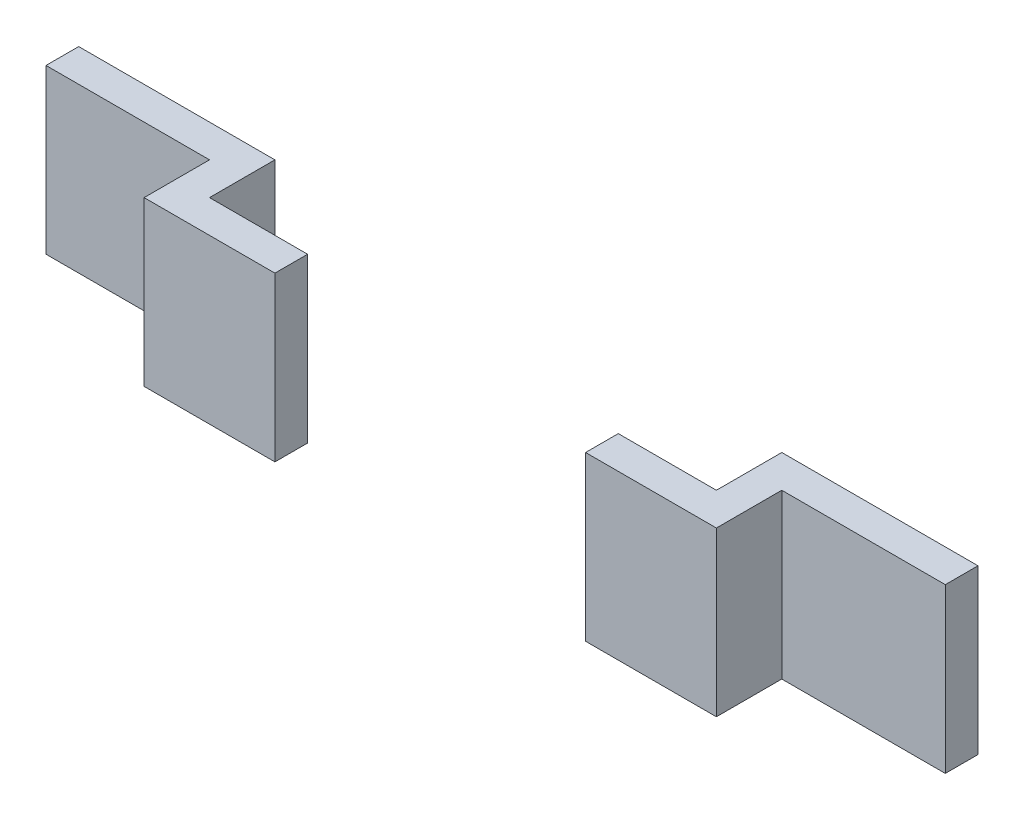
ISO-10303-21;
HEADER;
FILE_DESCRIPTION(('STEP AP214'),'2;1');
FILE_NAME('part.step','',(''),(''),'','','');
FILE_SCHEMA(('AUTOMOTIVE_DESIGN { 1 0 10303 214 1 1 1 1 }'));
ENDSEC;
DATA;
#1=APPLICATION_CONTEXT('core data for automotive mechanical design processes');
#2=APPLICATION_PROTOCOL_DEFINITION('international standard','automotive_design',2000,#1);
#3=PRODUCT_CONTEXT('',#1,'mechanical');
#4=PRODUCT('Part','Part','',(#3));
#5=PRODUCT_RELATED_PRODUCT_CATEGORY('part','',(#4));
#6=PRODUCT_DEFINITION_FORMATION('','',#4);
#7=PRODUCT_DEFINITION_CONTEXT('part definition',#1,'design');
#8=PRODUCT_DEFINITION('design','',#6,#7);
#9=PRODUCT_DEFINITION_SHAPE('','',#8);
#10=(LENGTH_UNIT() NAMED_UNIT(*) SI_UNIT(.MILLI.,.METRE.));
#11=(NAMED_UNIT(*) PLANE_ANGLE_UNIT() SI_UNIT($,.RADIAN.));
#12=(NAMED_UNIT(*) SI_UNIT($,.STERADIAN.) SOLID_ANGLE_UNIT());
#13=UNCERTAINTY_MEASURE_WITH_UNIT(LENGTH_MEASURE(1.E-05),#10,'distance_accuracy_value','');
#14=(GEOMETRIC_REPRESENTATION_CONTEXT(3) GLOBAL_UNCERTAINTY_ASSIGNED_CONTEXT((#13)) GLOBAL_UNIT_ASSIGNED_CONTEXT((#10,
#11,#12)) REPRESENTATION_CONTEXT('',''));
#15=CARTESIAN_POINT('',(0.,0.,0.));
#16=DIRECTION('',(0.,0.,1.));
#17=DIRECTION('',(1.,0.,0.));
#18=AXIS2_PLACEMENT_3D('',#15,#16,#17);
#19=CARTESIAN_POINT('',(7.75,2.5,3.));
#20=DIRECTION('',(1.,0.,0.));
#21=DIRECTION('',(0.,0.,-1.));
#22=AXIS2_PLACEMENT_3D('',#19,#20,#21);
#23=PLANE('',#22);
#24=DIRECTION('',(0.,-1.,0.));
#25=VECTOR('',#24,1.);
#26=CARTESIAN_POINT('',(7.75,2.5,2.));
#27=LINE('',#26,#25);
#28=CARTESIAN_POINT('',(7.75,2.5,2.));
#29=VERTEX_POINT('',#28);
#30=CARTESIAN_POINT('',(7.75,-2.5,2.));
#31=VERTEX_POINT('',#30);
#32=EDGE_CURVE('E12',#29,#31,#27,.T.);
#33=ORIENTED_EDGE('',*,*,#32,.F.);
#34=DIRECTION('',(0.,0.,-1.));
#35=VECTOR('',#34,1.);
#36=CARTESIAN_POINT('',(7.75,2.5,3.));
#37=LINE('',#36,#35);
#38=CARTESIAN_POINT('',(7.75,2.5,0.));
#39=VERTEX_POINT('',#38);
#40=EDGE_CURVE('E133',#29,#39,#37,.T.);
#41=ORIENTED_EDGE('',*,*,#40,.T.);
#42=DIRECTION('',(0.,-1.,0.));
#43=VECTOR('',#42,1.);
#44=CARTESIAN_POINT('',(7.75,2.5,0.));
#45=LINE('',#44,#43);
#46=CARTESIAN_POINT('',(7.75,-2.5,0.));
#47=VERTEX_POINT('',#46);
#48=EDGE_CURVE('E173',#39,#47,#45,.T.);
#49=ORIENTED_EDGE('',*,*,#48,.T.);
#50=DIRECTION('',(0.,0.,-1.));
#51=VECTOR('',#50,1.);
#52=CARTESIAN_POINT('',(7.75,-2.5,3.));
#53=LINE('',#52,#51);
#54=EDGE_CURVE('E164',#31,#47,#53,.T.);
#55=ORIENTED_EDGE('',*,*,#54,.F.);
#56=EDGE_LOOP('',(#33,#41,#49,#55));
#57=FACE_BOUND('',#56,.T.);
#58=ADVANCED_FACE('F60',(#57),#23,.F.);
#59=CARTESIAN_POINT('',(13.75,0.,1.));
#60=DIRECTION('',(1.,0.,0.));
#61=DIRECTION('',(0.,0.,-1.));
#62=AXIS2_PLACEMENT_3D('',#59,#60,#61);
#63=PLANE('',#62);
#64=DIRECTION('',(0.,-1.,0.));
#65=VECTOR('',#64,1.);
#66=CARTESIAN_POINT('',(13.75,0.,0.));
#67=LINE('',#66,#65);
#68=CARTESIAN_POINT('',(13.75,2.5,0.));
#69=VERTEX_POINT('',#68);
#70=CARTESIAN_POINT('',(13.75,-2.5,0.));
#71=VERTEX_POINT('',#70);
#72=EDGE_CURVE('E179',#69,#71,#67,.T.);
#73=ORIENTED_EDGE('',*,*,#72,.F.);
#74=DIRECTION('',(0.,0.,-1.));
#75=VECTOR('',#74,1.);
#76=CARTESIAN_POINT('',(13.75,2.5,1.));
#77=LINE('',#76,#75);
#78=CARTESIAN_POINT('',(13.75,2.5,1.));
#79=VERTEX_POINT('',#78);
#80=EDGE_CURVE('E67',#79,#69,#77,.T.);
#81=ORIENTED_EDGE('',*,*,#80,.F.);
#82=DIRECTION('',(0.,-1.,0.));
#83=VECTOR('',#82,1.);
#84=CARTESIAN_POINT('',(13.75,0.,1.));
#85=LINE('',#84,#83);
#86=CARTESIAN_POINT('',(13.75,-2.5,1.));
#87=VERTEX_POINT('',#86);
#88=EDGE_CURVE('E186',#79,#87,#85,.T.);
#89=ORIENTED_EDGE('',*,*,#88,.T.);
#90=DIRECTION('',(0.,0.,-1.));
#91=VECTOR('',#90,1.);
#92=CARTESIAN_POINT('',(13.75,-2.5,1.));
#93=LINE('',#92,#91);
#94=EDGE_CURVE('E92',#87,#71,#93,.T.);
#95=ORIENTED_EDGE('',*,*,#94,.T.);
#96=EDGE_LOOP('',(#73,#81,#89,#95));
#97=FACE_BOUND('',#96,.T.);
#98=ADVANCED_FACE('F56',(#97),#63,.T.);
#99=CARTESIAN_POINT('',(0.,2.5,1.));
#100=DIRECTION('',(0.,1.,0.));
#101=DIRECTION('',(0.,0.,1.));
#102=AXIS2_PLACEMENT_3D('',#99,#100,#101);
#103=PLANE('',#102);
#104=ORIENTED_EDGE('',*,*,#40,.F.);
#105=DIRECTION('',(-1.,0.,0.));
#106=VECTOR('',#105,1.);
#107=CARTESIAN_POINT('',(0.,2.5,2.));
#108=LINE('',#107,#106);
#109=CARTESIAN_POINT('',(4.75,2.5,2.));
#110=VERTEX_POINT('',#109);
#111=EDGE_CURVE('E126',#29,#110,#108,.T.);
#112=ORIENTED_EDGE('',*,*,#111,.T.);
#113=DIRECTION('',(0.,0.,1.));
#114=VECTOR('',#113,1.);
#115=CARTESIAN_POINT('',(4.75,2.5,2.));
#116=LINE('',#115,#114);
#117=CARTESIAN_POINT('',(4.75,2.5,3.));
#118=VERTEX_POINT('',#117);
#119=EDGE_CURVE('E135',#110,#118,#116,.T.);
#120=ORIENTED_EDGE('',*,*,#119,.T.);
#121=DIRECTION('',(-1.,0.,0.));
#122=VECTOR('',#121,1.);
#123=CARTESIAN_POINT('',(8.75,2.5,3.));
#124=LINE('',#123,#122);
#125=CARTESIAN_POINT('',(8.75,2.5,3.));
#126=VERTEX_POINT('',#125);
#127=EDGE_CURVE('E176',#126,#118,#124,.T.);
#128=ORIENTED_EDGE('',*,*,#127,.F.);
#129=DIRECTION('',(0.,0.,-1.));
#130=VECTOR('',#129,1.);
#131=CARTESIAN_POINT('',(8.75,2.5,3.));
#132=LINE('',#131,#130);
#133=CARTESIAN_POINT('',(8.75,2.5,1.));
#134=VERTEX_POINT('',#133);
#135=EDGE_CURVE('E172',#126,#134,#132,.T.);
#136=ORIENTED_EDGE('',*,*,#135,.T.);
#137=DIRECTION('',(1.,0.,0.));
#138=VECTOR('',#137,1.);
#139=CARTESIAN_POINT('',(0.,2.5,1.));
#140=LINE('',#139,#138);
#141=EDGE_CURVE('E195',#134,#79,#140,.T.);
#142=ORIENTED_EDGE('',*,*,#141,.T.);
#143=ORIENTED_EDGE('',*,*,#80,.T.);
#144=DIRECTION('',(1.,0.,0.));
#145=VECTOR('',#144,1.);
#146=CARTESIAN_POINT('',(0.,2.5,0.));
#147=LINE('',#146,#145);
#148=EDGE_CURVE('E202',#39,#69,#147,.T.);
#149=ORIENTED_EDGE('',*,*,#148,.F.);
#150=EDGE_LOOP('',(#104,#112,#120,#128,#136,#142,#143,#149));
#151=FACE_BOUND('',#150,.T.);
#152=ADVANCED_FACE('F128',(#151),#103,.T.);
#153=CARTESIAN_POINT('',(0.,-2.5,1.));
#154=DIRECTION('',(0.,1.,0.));
#155=DIRECTION('',(0.,0.,1.));
#156=AXIS2_PLACEMENT_3D('',#153,#154,#155);
#157=PLANE('',#156);
#158=DIRECTION('',(1.,0.,0.));
#159=VECTOR('',#158,1.);
#160=CARTESIAN_POINT('',(0.,-2.5,1.));
#161=LINE('',#160,#159);
#162=CARTESIAN_POINT('',(8.75,-2.5,1.));
#163=VERTEX_POINT('',#162);
#164=EDGE_CURVE('E78',#163,#87,#161,.T.);
#165=ORIENTED_EDGE('',*,*,#164,.F.);
#166=DIRECTION('',(0.,0.,-1.));
#167=VECTOR('',#166,1.);
#168=CARTESIAN_POINT('',(8.75,-2.5,3.));
#169=LINE('',#168,#167);
#170=CARTESIAN_POINT('',(8.75,-2.5,3.));
#171=VERTEX_POINT('',#170);
#172=EDGE_CURVE('E169',#171,#163,#169,.T.);
#173=ORIENTED_EDGE('',*,*,#172,.F.);
#174=DIRECTION('',(-1.,0.,0.));
#175=VECTOR('',#174,1.);
#176=CARTESIAN_POINT('',(8.75,-2.5,3.));
#177=LINE('',#176,#175);
#178=CARTESIAN_POINT('',(4.75,-2.5,3.));
#179=VERTEX_POINT('',#178);
#180=EDGE_CURVE('E184',#171,#179,#177,.T.);
#181=ORIENTED_EDGE('',*,*,#180,.T.);
#182=DIRECTION('',(0.,0.,1.));
#183=VECTOR('',#182,1.);
#184=CARTESIAN_POINT('',(4.75,-2.5,2.));
#185=LINE('',#184,#183);
#186=CARTESIAN_POINT('',(4.75,-2.5,2.));
#187=VERTEX_POINT('',#186);
#188=EDGE_CURVE('E146',#187,#179,#185,.T.);
#189=ORIENTED_EDGE('',*,*,#188,.F.);
#190=DIRECTION('',(-1.,0.,0.));
#191=VECTOR('',#190,1.);
#192=CARTESIAN_POINT('',(0.,-2.5,2.));
#193=LINE('',#192,#191);
#194=EDGE_CURVE('E149',#31,#187,#193,.T.);
#195=ORIENTED_EDGE('',*,*,#194,.F.);
#196=ORIENTED_EDGE('',*,*,#54,.T.);
#197=DIRECTION('',(1.,0.,0.));
#198=VECTOR('',#197,1.);
#199=CARTESIAN_POINT('',(0.,-2.5,0.));
#200=LINE('',#199,#198);
#201=EDGE_CURVE('E193',#47,#71,#200,.T.);
#202=ORIENTED_EDGE('',*,*,#201,.T.);
#203=ORIENTED_EDGE('',*,*,#94,.F.);
#204=EDGE_LOOP('',(#165,#173,#181,#189,#195,#196,#202,#203));
#205=FACE_BOUND('',#204,.T.);
#206=ADVANCED_FACE('F218',(#205),#157,.F.);
#207=CARTESIAN_POINT('',(0.,0.,1.));
#208=DIRECTION('',(0.,0.,1.));
#209=DIRECTION('',(1.,0.,0.));
#210=AXIS2_PLACEMENT_3D('',#207,#208,#209);
#211=PLANE('',#210);
#212=ORIENTED_EDGE('',*,*,#88,.F.);
#213=ORIENTED_EDGE('',*,*,#141,.F.);
#214=DIRECTION('',(0.,-1.,0.));
#215=VECTOR('',#214,1.);
#216=CARTESIAN_POINT('',(8.75,0.,1.));
#217=LINE('',#216,#215);
#218=EDGE_CURVE('E197',#134,#163,#217,.T.);
#219=ORIENTED_EDGE('',*,*,#218,.T.);
#220=ORIENTED_EDGE('',*,*,#164,.T.);
#221=EDGE_LOOP('',(#212,#213,#219,#220));
#222=FACE_BOUND('',#221,.T.);
#223=ADVANCED_FACE('F230',(#222),#211,.T.);
#224=CARTESIAN_POINT('',(0.,0.,0.));
#225=DIRECTION('',(0.,0.,1.));
#226=DIRECTION('',(1.,0.,0.));
#227=AXIS2_PLACEMENT_3D('',#224,#225,#226);
#228=PLANE('',#227);
#229=ORIENTED_EDGE('',*,*,#72,.T.);
#230=ORIENTED_EDGE('',*,*,#201,.F.);
#231=ORIENTED_EDGE('',*,*,#48,.F.);
#232=ORIENTED_EDGE('',*,*,#148,.T.);
#233=EDGE_LOOP('',(#229,#230,#231,#232));
#234=FACE_BOUND('',#233,.T.);
#235=ADVANCED_FACE('F220',(#234),#228,.F.);
#236=CARTESIAN_POINT('',(8.75,2.5,3.));
#237=DIRECTION('',(1.,0.,0.));
#238=DIRECTION('',(0.,0.,-1.));
#239=AXIS2_PLACEMENT_3D('',#236,#237,#238);
#240=PLANE('',#239);
#241=ORIENTED_EDGE('',*,*,#172,.T.);
#242=ORIENTED_EDGE('',*,*,#218,.F.);
#243=ORIENTED_EDGE('',*,*,#135,.F.);
#244=DIRECTION('',(0.,-1.,0.));
#245=VECTOR('',#244,1.);
#246=CARTESIAN_POINT('',(8.75,2.5,3.));
#247=LINE('',#246,#245);
#248=EDGE_CURVE('E171',#126,#171,#247,.T.);
#249=ORIENTED_EDGE('',*,*,#248,.T.);
#250=EDGE_LOOP('',(#241,#242,#243,#249));
#251=FACE_BOUND('',#250,.T.);
#252=ADVANCED_FACE('F227',(#251),#240,.T.);
#253=CARTESIAN_POINT('',(0.,0.,3.));
#254=DIRECTION('',(0.,0.,1.));
#255=DIRECTION('',(1.,0.,0.));
#256=AXIS2_PLACEMENT_3D('',#253,#254,#255);
#257=PLANE('',#256);
#258=ORIENTED_EDGE('',*,*,#127,.T.);
#259=DIRECTION('',(0.,-1.,0.));
#260=VECTOR('',#259,1.);
#261=CARTESIAN_POINT('',(4.75,0.,3.));
#262=LINE('',#261,#260);
#263=EDGE_CURVE('E136',#118,#179,#262,.T.);
#264=ORIENTED_EDGE('',*,*,#263,.T.);
#265=ORIENTED_EDGE('',*,*,#180,.F.);
#266=ORIENTED_EDGE('',*,*,#248,.F.);
#267=EDGE_LOOP('',(#258,#264,#265,#266));
#268=FACE_BOUND('',#267,.T.);
#269=ADVANCED_FACE('F225',(#268),#257,.T.);
#270=CARTESIAN_POINT('',(0.,0.,2.));
#271=DIRECTION('',(0.,0.,1.));
#272=DIRECTION('',(1.,0.,0.));
#273=AXIS2_PLACEMENT_3D('',#270,#271,#272);
#274=PLANE('',#273);
#275=ORIENTED_EDGE('',*,*,#111,.F.);
#276=ORIENTED_EDGE('',*,*,#32,.T.);
#277=ORIENTED_EDGE('',*,*,#194,.T.);
#278=DIRECTION('',(0.,-1.,0.));
#279=VECTOR('',#278,1.);
#280=CARTESIAN_POINT('',(4.75,0.,2.));
#281=LINE('',#280,#279);
#282=EDGE_CURVE('E139',#110,#187,#281,.T.);
#283=ORIENTED_EDGE('',*,*,#282,.F.);
#284=EDGE_LOOP('',(#275,#276,#277,#283));
#285=FACE_BOUND('',#284,.T.);
#286=ADVANCED_FACE('F151',(#285),#274,.F.);
#287=CARTESIAN_POINT('',(4.75,0.,2.));
#288=DIRECTION('',(-1.,0.,0.));
#289=DIRECTION('',(0.,-1.,0.));
#290=AXIS2_PLACEMENT_3D('',#287,#288,#289);
#291=PLANE('',#290);
#292=ORIENTED_EDGE('',*,*,#263,.F.);
#293=ORIENTED_EDGE('',*,*,#119,.F.);
#294=ORIENTED_EDGE('',*,*,#282,.T.);
#295=ORIENTED_EDGE('',*,*,#188,.T.);
#296=EDGE_LOOP('',(#292,#293,#294,#295));
#297=FACE_BOUND('',#296,.T.);
#298=ADVANCED_FACE('F145',(#297),#291,.T.);
#299=CLOSED_SHELL('',(#58,#98,#152,#206,#223,#235,#252,#269,#286,#298));
#300=MANIFOLD_SOLID_BREP('B2',#299);
#301=CARTESIAN_POINT('',(-13.75,0.,1.));
#302=DIRECTION('',(1.,0.,0.));
#303=DIRECTION('',(0.,0.,-1.));
#304=AXIS2_PLACEMENT_3D('',#301,#302,#303);
#305=PLANE('',#304);
#306=DIRECTION('',(0.,-1.,0.));
#307=VECTOR('',#306,1.);
#308=CARTESIAN_POINT('',(-13.75,0.,0.));
#309=LINE('',#308,#307);
#310=CARTESIAN_POINT('',(-13.75,2.5,0.));
#311=VERTEX_POINT('',#310);
#312=CARTESIAN_POINT('',(-13.75,-2.5,0.));
#313=VERTEX_POINT('',#312);
#314=EDGE_CURVE('E437',#311,#313,#309,.T.);
#315=ORIENTED_EDGE('',*,*,#314,.T.);
#316=DIRECTION('',(0.,0.,-1.));
#317=VECTOR('',#316,1.);
#318=CARTESIAN_POINT('',(-13.75,-2.5,1.));
#319=LINE('',#318,#317);
#320=CARTESIAN_POINT('',(-13.75,-2.5,1.));
#321=VERTEX_POINT('',#320);
#322=EDGE_CURVE('E54',#321,#313,#319,.T.);
#323=ORIENTED_EDGE('',*,*,#322,.F.);
#324=DIRECTION('',(0.,-1.,0.));
#325=VECTOR('',#324,1.);
#326=CARTESIAN_POINT('',(-13.75,0.,1.));
#327=LINE('',#326,#325);
#328=CARTESIAN_POINT('',(-13.75,2.5,1.));
#329=VERTEX_POINT('',#328);
#330=EDGE_CURVE('E441',#329,#321,#327,.T.);
#331=ORIENTED_EDGE('',*,*,#330,.F.);
#332=DIRECTION('',(0.,0.,-1.));
#333=VECTOR('',#332,1.);
#334=CARTESIAN_POINT('',(-13.75,2.5,1.));
#335=LINE('',#334,#333);
#336=EDGE_CURVE('E331',#329,#311,#335,.T.);
#337=ORIENTED_EDGE('',*,*,#336,.T.);
#338=EDGE_LOOP('',(#315,#323,#331,#337));
#339=FACE_BOUND('',#338,.T.);
#340=ADVANCED_FACE('F330',(#339),#305,.F.);
#341=CARTESIAN_POINT('',(0.,-2.5,1.));
#342=DIRECTION('',(0.,1.,0.));
#343=DIRECTION('',(0.,0.,1.));
#344=AXIS2_PLACEMENT_3D('',#341,#342,#343);
#345=PLANE('',#344);
#346=DIRECTION('',(1.,0.,0.));
#347=VECTOR('',#346,1.);
#348=CARTESIAN_POINT('',(0.,-2.5,0.));
#349=LINE('',#348,#347);
#350=CARTESIAN_POINT('',(-7.75,-2.5,0.));
#351=VERTEX_POINT('',#350);
#352=EDGE_CURVE('E454',#313,#351,#349,.T.);
#353=ORIENTED_EDGE('',*,*,#352,.T.);
#354=DIRECTION('',(0.,0.,-1.));
#355=VECTOR('',#354,1.);
#356=CARTESIAN_POINT('',(-7.75,-2.5,3.));
#357=LINE('',#356,#355);
#358=CARTESIAN_POINT('',(-7.75,-2.5,2.));
#359=VERTEX_POINT('',#358);
#360=EDGE_CURVE('E442',#359,#351,#357,.T.);
#361=ORIENTED_EDGE('',*,*,#360,.F.);
#362=DIRECTION('',(1.,0.,0.));
#363=VECTOR('',#362,1.);
#364=CARTESIAN_POINT('',(0.,-2.5,2.));
#365=LINE('',#364,#363);
#366=CARTESIAN_POINT('',(-4.75,-2.5,2.));
#367=VERTEX_POINT('',#366);
#368=EDGE_CURVE('E414',#359,#367,#365,.T.);
#369=ORIENTED_EDGE('',*,*,#368,.T.);
#370=DIRECTION('',(0.,0.,1.));
#371=VECTOR('',#370,1.);
#372=CARTESIAN_POINT('',(-4.75,-2.5,2.));
#373=LINE('',#372,#371);
#374=CARTESIAN_POINT('',(-4.75,-2.5,3.));
#375=VERTEX_POINT('',#374);
#376=EDGE_CURVE('E413',#367,#375,#373,.T.);
#377=ORIENTED_EDGE('',*,*,#376,.T.);
#378=DIRECTION('',(1.,0.,0.));
#379=VECTOR('',#378,1.);
#380=CARTESIAN_POINT('',(-8.75,-2.5,3.));
#381=LINE('',#380,#379);
#382=CARTESIAN_POINT('',(-8.75,-2.5,3.));
#383=VERTEX_POINT('',#382);
#384=EDGE_CURVE('E428',#383,#375,#381,.T.);
#385=ORIENTED_EDGE('',*,*,#384,.F.);
#386=DIRECTION('',(0.,0.,-1.));
#387=VECTOR('',#386,1.);
#388=CARTESIAN_POINT('',(-8.75,-2.5,3.));
#389=LINE('',#388,#387);
#390=CARTESIAN_POINT('',(-8.75,-2.5,1.));
#391=VERTEX_POINT('',#390);
#392=EDGE_CURVE('E438',#383,#391,#389,.T.);
#393=ORIENTED_EDGE('',*,*,#392,.T.);
#394=DIRECTION('',(1.,0.,0.));
#395=VECTOR('',#394,1.);
#396=CARTESIAN_POINT('',(0.,-2.5,1.));
#397=LINE('',#396,#395);
#398=EDGE_CURVE('E370',#321,#391,#397,.T.);
#399=ORIENTED_EDGE('',*,*,#398,.F.);
#400=ORIENTED_EDGE('',*,*,#322,.T.);
#401=EDGE_LOOP('',(#353,#361,#369,#377,#385,#393,#399,#400));
#402=FACE_BOUND('',#401,.T.);
#403=ADVANCED_FACE('F465',(#402),#345,.F.);
#404=CARTESIAN_POINT('',(0.,2.5,1.));
#405=DIRECTION('',(0.,1.,0.));
#406=DIRECTION('',(0.,0.,1.));
#407=AXIS2_PLACEMENT_3D('',#404,#405,#406);
#408=PLANE('',#407);
#409=DIRECTION('',(1.,0.,0.));
#410=VECTOR('',#409,1.);
#411=CARTESIAN_POINT('',(0.,2.5,0.));
#412=LINE('',#411,#410);
#413=CARTESIAN_POINT('',(-7.75,2.5,0.));
#414=VERTEX_POINT('',#413);
#415=EDGE_CURVE('E447',#311,#414,#412,.T.);
#416=ORIENTED_EDGE('',*,*,#415,.F.);
#417=ORIENTED_EDGE('',*,*,#336,.F.);
#418=DIRECTION('',(1.,0.,0.));
#419=VECTOR('',#418,1.);
#420=CARTESIAN_POINT('',(0.,2.5,1.));
#421=LINE('',#420,#419);
#422=CARTESIAN_POINT('',(-8.75,2.5,1.));
#423=VERTEX_POINT('',#422);
#424=EDGE_CURVE('E452',#329,#423,#421,.T.);
#425=ORIENTED_EDGE('',*,*,#424,.T.);
#426=DIRECTION('',(0.,0.,-1.));
#427=VECTOR('',#426,1.);
#428=CARTESIAN_POINT('',(-8.75,2.5,3.));
#429=LINE('',#428,#427);
#430=CARTESIAN_POINT('',(-8.75,2.5,3.));
#431=VERTEX_POINT('',#430);
#432=EDGE_CURVE('E434',#431,#423,#429,.T.);
#433=ORIENTED_EDGE('',*,*,#432,.F.);
#434=DIRECTION('',(1.,0.,0.));
#435=VECTOR('',#434,1.);
#436=CARTESIAN_POINT('',(-8.75,2.5,3.));
#437=LINE('',#436,#435);
#438=CARTESIAN_POINT('',(-4.75,2.5,3.));
#439=VERTEX_POINT('',#438);
#440=EDGE_CURVE('E406',#431,#439,#437,.T.);
#441=ORIENTED_EDGE('',*,*,#440,.T.);
#442=DIRECTION('',(0.,0.,1.));
#443=VECTOR('',#442,1.);
#444=CARTESIAN_POINT('',(-4.75,2.5,2.));
#445=LINE('',#444,#443);
#446=CARTESIAN_POINT('',(-4.75,2.5,2.));
#447=VERTEX_POINT('',#446);
#448=EDGE_CURVE('E407',#447,#439,#445,.T.);
#449=ORIENTED_EDGE('',*,*,#448,.F.);
#450=DIRECTION('',(1.,0.,0.));
#451=VECTOR('',#450,1.);
#452=CARTESIAN_POINT('',(0.,2.5,2.));
#453=LINE('',#452,#451);
#454=CARTESIAN_POINT('',(-7.75,2.5,2.));
#455=VERTEX_POINT('',#454);
#456=EDGE_CURVE('E400',#455,#447,#453,.T.);
#457=ORIENTED_EDGE('',*,*,#456,.F.);
#458=DIRECTION('',(0.,0.,-1.));
#459=VECTOR('',#458,1.);
#460=CARTESIAN_POINT('',(-7.75,2.5,3.));
#461=LINE('',#460,#459);
#462=EDGE_CURVE('E435',#455,#414,#461,.T.);
#463=ORIENTED_EDGE('',*,*,#462,.T.);
#464=EDGE_LOOP('',(#416,#417,#425,#433,#441,#449,#457,#463));
#465=FACE_BOUND('',#464,.T.);
#466=ADVANCED_FACE('F410',(#465),#408,.T.);
#467=CARTESIAN_POINT('',(0.,0.,1.));
#468=DIRECTION('',(0.,0.,1.));
#469=DIRECTION('',(1.,0.,0.));
#470=AXIS2_PLACEMENT_3D('',#467,#468,#469);
#471=PLANE('',#470);
#472=ORIENTED_EDGE('',*,*,#330,.T.);
#473=ORIENTED_EDGE('',*,*,#398,.T.);
#474=DIRECTION('',(0.,-1.,0.));
#475=VECTOR('',#474,1.);
#476=CARTESIAN_POINT('',(-8.75,0.,1.));
#477=LINE('',#476,#475);
#478=EDGE_CURVE('E449',#423,#391,#477,.T.);
#479=ORIENTED_EDGE('',*,*,#478,.F.);
#480=ORIENTED_EDGE('',*,*,#424,.F.);
#481=EDGE_LOOP('',(#472,#473,#479,#480));
#482=FACE_BOUND('',#481,.T.);
#483=ADVANCED_FACE('F471',(#482),#471,.T.);
#484=CARTESIAN_POINT('',(0.,0.,0.));
#485=DIRECTION('',(0.,0.,1.));
#486=DIRECTION('',(1.,0.,0.));
#487=AXIS2_PLACEMENT_3D('',#484,#485,#486);
#488=PLANE('',#487);
#489=ORIENTED_EDGE('',*,*,#314,.F.);
#490=ORIENTED_EDGE('',*,*,#415,.T.);
#491=DIRECTION('',(0.,-1.,0.));
#492=VECTOR('',#491,1.);
#493=CARTESIAN_POINT('',(-7.75,2.5,0.));
#494=LINE('',#493,#492);
#495=EDGE_CURVE('E422',#414,#351,#494,.T.);
#496=ORIENTED_EDGE('',*,*,#495,.T.);
#497=ORIENTED_EDGE('',*,*,#352,.F.);
#498=EDGE_LOOP('',(#489,#490,#496,#497));
#499=FACE_BOUND('',#498,.T.);
#500=ADVANCED_FACE('F458',(#499),#488,.F.);
#501=CARTESIAN_POINT('',(-8.75,2.5,3.));
#502=DIRECTION('',(1.,0.,0.));
#503=DIRECTION('',(0.,0.,-1.));
#504=AXIS2_PLACEMENT_3D('',#501,#502,#503);
#505=PLANE('',#504);
#506=ORIENTED_EDGE('',*,*,#432,.T.);
#507=ORIENTED_EDGE('',*,*,#478,.T.);
#508=ORIENTED_EDGE('',*,*,#392,.F.);
#509=DIRECTION('',(0.,-1.,0.));
#510=VECTOR('',#509,1.);
#511=CARTESIAN_POINT('',(-8.75,2.5,3.));
#512=LINE('',#511,#510);
#513=EDGE_CURVE('E429',#431,#383,#512,.T.);
#514=ORIENTED_EDGE('',*,*,#513,.F.);
#515=EDGE_LOOP('',(#506,#507,#508,#514));
#516=FACE_BOUND('',#515,.T.);
#517=ADVANCED_FACE('F476',(#516),#505,.F.);
#518=CARTESIAN_POINT('',(-7.75,2.5,3.));
#519=DIRECTION('',(1.,0.,0.));
#520=DIRECTION('',(0.,1.,0.));
#521=AXIS2_PLACEMENT_3D('',#518,#519,#520);
#522=PLANE('',#521);
#523=DIRECTION('',(0.,1.,0.));
#524=VECTOR('',#523,1.);
#525=CARTESIAN_POINT('',(-7.75,0.,2.));
#526=LINE('',#525,#524);
#527=EDGE_CURVE('E342',#359,#455,#526,.T.);
#528=ORIENTED_EDGE('',*,*,#527,.F.);
#529=ORIENTED_EDGE('',*,*,#360,.T.);
#530=ORIENTED_EDGE('',*,*,#495,.F.);
#531=ORIENTED_EDGE('',*,*,#462,.F.);
#532=EDGE_LOOP('',(#528,#529,#530,#531));
#533=FACE_BOUND('',#532,.T.);
#534=ADVANCED_FACE('F462',(#533),#522,.T.);
#535=CARTESIAN_POINT('',(0.,0.,3.));
#536=DIRECTION('',(0.,0.,-1.));
#537=DIRECTION('',(-1.,0.,0.));
#538=AXIS2_PLACEMENT_3D('',#535,#536,#537);
#539=PLANE('',#538);
#540=ORIENTED_EDGE('',*,*,#440,.F.);
#541=ORIENTED_EDGE('',*,*,#513,.T.);
#542=ORIENTED_EDGE('',*,*,#384,.T.);
#543=DIRECTION('',(0.,-1.,0.));
#544=VECTOR('',#543,1.);
#545=CARTESIAN_POINT('',(-4.75,0.,3.));
#546=LINE('',#545,#544);
#547=EDGE_CURVE('E420',#439,#375,#546,.T.);
#548=ORIENTED_EDGE('',*,*,#547,.F.);
#549=EDGE_LOOP('',(#540,#541,#542,#548));
#550=FACE_BOUND('',#549,.T.);
#551=ADVANCED_FACE('F483',(#550),#539,.F.);
#552=CARTESIAN_POINT('',(-4.75,0.,2.));
#553=DIRECTION('',(-1.,0.,0.));
#554=DIRECTION('',(0.,-1.,0.));
#555=AXIS2_PLACEMENT_3D('',#552,#553,#554);
#556=PLANE('',#555);
#557=ORIENTED_EDGE('',*,*,#547,.T.);
#558=ORIENTED_EDGE('',*,*,#376,.F.);
#559=DIRECTION('',(0.,-1.,0.));
#560=VECTOR('',#559,1.);
#561=CARTESIAN_POINT('',(-4.75,0.,2.));
#562=LINE('',#561,#560);
#563=EDGE_CURVE('E405',#447,#367,#562,.T.);
#564=ORIENTED_EDGE('',*,*,#563,.F.);
#565=ORIENTED_EDGE('',*,*,#448,.T.);
#566=EDGE_LOOP('',(#557,#558,#564,#565));
#567=FACE_BOUND('',#566,.T.);
#568=ADVANCED_FACE('F418',(#567),#556,.F.);
#569=CARTESIAN_POINT('',(0.,0.,2.));
#570=DIRECTION('',(0.,0.,1.));
#571=DIRECTION('',(1.,0.,0.));
#572=AXIS2_PLACEMENT_3D('',#569,#570,#571);
#573=PLANE('',#572);
#574=ORIENTED_EDGE('',*,*,#563,.T.);
#575=ORIENTED_EDGE('',*,*,#368,.F.);
#576=ORIENTED_EDGE('',*,*,#527,.T.);
#577=ORIENTED_EDGE('',*,*,#456,.T.);
#578=EDGE_LOOP('',(#574,#575,#576,#577));
#579=FACE_BOUND('',#578,.T.);
#580=ADVANCED_FACE('F399',(#579),#573,.F.);
#581=CLOSED_SHELL('',(#340,#403,#466,#483,#500,#517,#534,#551,#568,#580));
#582=MANIFOLD_SOLID_BREP('B6',#581);
#583=ADVANCED_BREP_SHAPE_REPRESENTATION('',(#18,#300,#582),#14);
#584=SHAPE_DEFINITION_REPRESENTATION(#9,#583);
ENDSEC;
END-ISO-10303-21;
